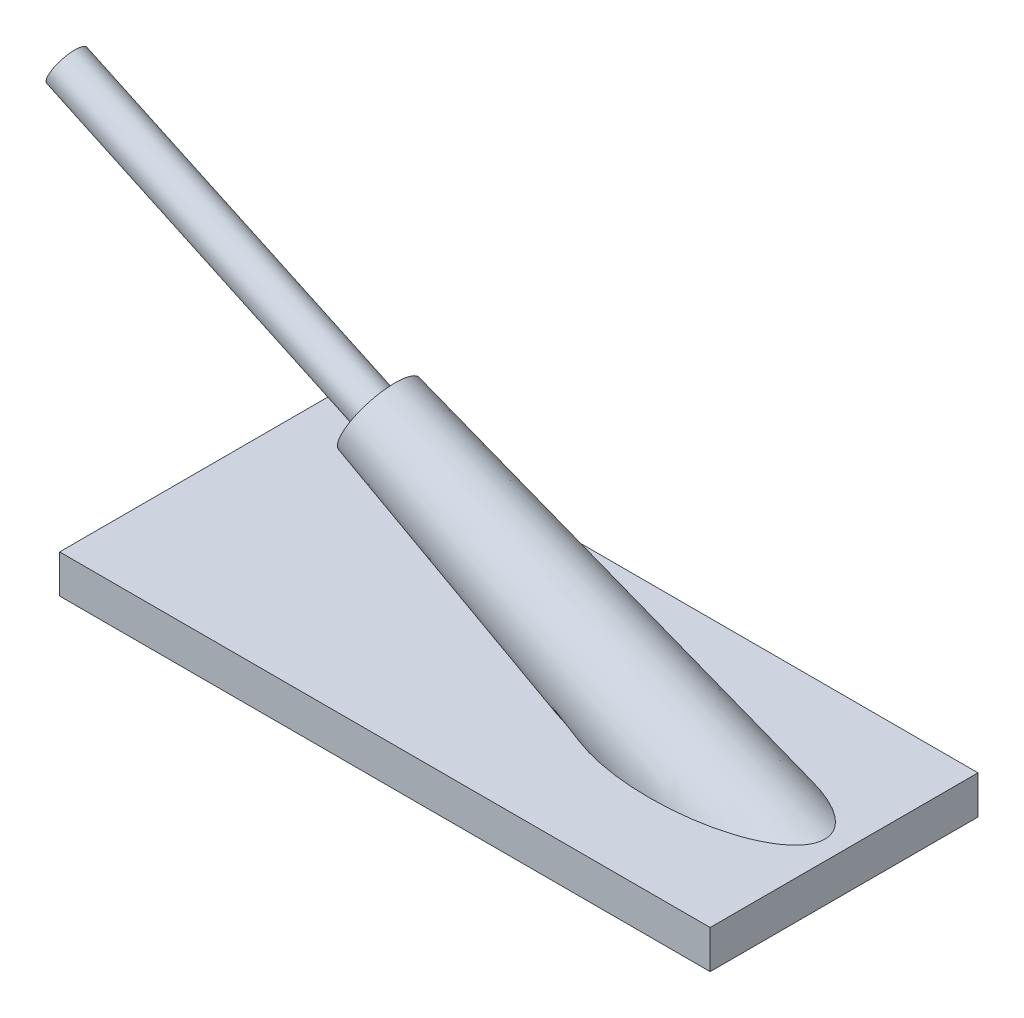
ISO-10303-21;
HEADER;
FILE_DESCRIPTION(('STEP AP214'),'2;1');
FILE_NAME('part.step','',(''),(''),'','','');
FILE_SCHEMA(('AUTOMOTIVE_DESIGN { 1 0 10303 214 1 1 1 1 }'));
ENDSEC;
DATA;
#1=APPLICATION_CONTEXT('core data for automotive mechanical design processes');
#2=APPLICATION_PROTOCOL_DEFINITION('international standard','automotive_design',2000,#1);
#3=PRODUCT_CONTEXT('',#1,'mechanical');
#4=PRODUCT('Part','Part','',(#3));
#5=PRODUCT_RELATED_PRODUCT_CATEGORY('part','',(#4));
#6=PRODUCT_DEFINITION_FORMATION('','',#4);
#7=PRODUCT_DEFINITION_CONTEXT('part definition',#1,'design');
#8=PRODUCT_DEFINITION('design','',#6,#7);
#9=PRODUCT_DEFINITION_SHAPE('','',#8);
#10=(LENGTH_UNIT() NAMED_UNIT(*) SI_UNIT(.MILLI.,.METRE.));
#11=(NAMED_UNIT(*) PLANE_ANGLE_UNIT() SI_UNIT($,.RADIAN.));
#12=(NAMED_UNIT(*) SI_UNIT($,.STERADIAN.) SOLID_ANGLE_UNIT());
#13=UNCERTAINTY_MEASURE_WITH_UNIT(LENGTH_MEASURE(1.E-05),#10,'distance_accuracy_value','');
#14=(GEOMETRIC_REPRESENTATION_CONTEXT(3) GLOBAL_UNCERTAINTY_ASSIGNED_CONTEXT((#13)) GLOBAL_UNIT_ASSIGNED_CONTEXT((#10,
#11,#12)) REPRESENTATION_CONTEXT('',''));
#15=CARTESIAN_POINT('',(0.,0.,0.));
#16=DIRECTION('',(0.,0.,1.));
#17=DIRECTION('',(1.,0.,0.));
#18=AXIS2_PLACEMENT_3D('',#15,#16,#17);
#19=CARTESIAN_POINT('',(85.,10.,35.));
#20=DIRECTION('',(-1.,0.,0.));
#21=DIRECTION('',(0.,0.,1.));
#22=AXIS2_PLACEMENT_3D('',#19,#20,#21);
#23=PLANE('',#22);
#24=DIRECTION('',(0.,0.,-1.));
#25=VECTOR('',#24,1.);
#26=CARTESIAN_POINT('',(85.,0.,35.));
#27=LINE('',#26,#25);
#28=CARTESIAN_POINT('',(85.,0.,35.));
#29=VERTEX_POINT('',#28);
#30=CARTESIAN_POINT('',(85.,0.,-35.));
#31=VERTEX_POINT('',#30);
#32=EDGE_CURVE('E118',#29,#31,#27,.T.);
#33=ORIENTED_EDGE('',*,*,#32,.T.);
#34=DIRECTION('',(0.,-1.,0.));
#35=VECTOR('',#34,1.);
#36=CARTESIAN_POINT('',(85.,10.,-35.));
#37=LINE('',#36,#35);
#38=CARTESIAN_POINT('',(85.,10.,-35.));
#39=VERTEX_POINT('',#38);
#40=EDGE_CURVE('E55',#39,#31,#37,.T.);
#41=ORIENTED_EDGE('',*,*,#40,.F.);
#42=DIRECTION('',(0.,0.,-1.));
#43=VECTOR('',#42,1.);
#44=CARTESIAN_POINT('',(85.,10.,35.));
#45=LINE('',#44,#43);
#46=CARTESIAN_POINT('',(85.,10.,35.));
#47=VERTEX_POINT('',#46);
#48=EDGE_CURVE('E100',#47,#39,#45,.T.);
#49=ORIENTED_EDGE('',*,*,#48,.F.);
#50=DIRECTION('',(0.,-1.,0.));
#51=VECTOR('',#50,1.);
#52=CARTESIAN_POINT('',(85.,10.,35.));
#53=LINE('',#52,#51);
#54=EDGE_CURVE('E114',#47,#29,#53,.T.);
#55=ORIENTED_EDGE('',*,*,#54,.T.);
#56=EDGE_LOOP('',(#33,#41,#49,#55));
#57=FACE_BOUND('',#56,.T.);
#58=ADVANCED_FACE('F45',(#57),#23,.F.);
#59=CARTESIAN_POINT('',(-85.,10.,-35.));
#60=DIRECTION('',(0.,0.,1.));
#61=DIRECTION('',(1.,0.,0.));
#62=AXIS2_PLACEMENT_3D('',#59,#60,#61);
#63=PLANE('',#62);
#64=DIRECTION('',(-1.,0.,0.));
#65=VECTOR('',#64,1.);
#66=CARTESIAN_POINT('',(-85.,0.,-35.));
#67=LINE('',#66,#65);
#68=CARTESIAN_POINT('',(-85.,0.,-35.));
#69=VERTEX_POINT('',#68);
#70=EDGE_CURVE('E106',#31,#69,#67,.T.);
#71=ORIENTED_EDGE('',*,*,#70,.T.);
#72=DIRECTION('',(0.,-1.,0.));
#73=VECTOR('',#72,1.);
#74=CARTESIAN_POINT('',(-85.,10.,-35.));
#75=LINE('',#74,#73);
#76=CARTESIAN_POINT('',(-85.,10.,-35.));
#77=VERTEX_POINT('',#76);
#78=EDGE_CURVE('E104',#77,#69,#75,.T.);
#79=ORIENTED_EDGE('',*,*,#78,.F.);
#80=DIRECTION('',(-1.,0.,0.));
#81=VECTOR('',#80,1.);
#82=CARTESIAN_POINT('',(-85.,10.,-35.));
#83=LINE('',#82,#81);
#84=EDGE_CURVE('E95',#39,#77,#83,.T.);
#85=ORIENTED_EDGE('',*,*,#84,.F.);
#86=ORIENTED_EDGE('',*,*,#40,.T.);
#87=EDGE_LOOP('',(#71,#79,#85,#86));
#88=FACE_BOUND('',#87,.T.);
#89=ADVANCED_FACE('F105',(#88),#63,.F.);
#90=CARTESIAN_POINT('',(-85.,10.,35.));
#91=DIRECTION('',(1.,0.,0.));
#92=DIRECTION('',(0.,0.,-1.));
#93=AXIS2_PLACEMENT_3D('',#90,#91,#92);
#94=PLANE('',#93);
#95=DIRECTION('',(0.,0.,1.));
#96=VECTOR('',#95,1.);
#97=CARTESIAN_POINT('',(-85.,0.,35.));
#98=LINE('',#97,#96);
#99=CARTESIAN_POINT('',(-85.,0.,35.));
#100=VERTEX_POINT('',#99);
#101=EDGE_CURVE('E81',#69,#100,#98,.T.);
#102=ORIENTED_EDGE('',*,*,#101,.T.);
#103=DIRECTION('',(0.,-1.,0.));
#104=VECTOR('',#103,1.);
#105=CARTESIAN_POINT('',(-85.,10.,35.));
#106=LINE('',#105,#104);
#107=CARTESIAN_POINT('',(-85.,10.,35.));
#108=VERTEX_POINT('',#107);
#109=EDGE_CURVE('E108',#108,#100,#106,.T.);
#110=ORIENTED_EDGE('',*,*,#109,.F.);
#111=DIRECTION('',(0.,0.,1.));
#112=VECTOR('',#111,1.);
#113=CARTESIAN_POINT('',(-85.,10.,35.));
#114=LINE('',#113,#112);
#115=EDGE_CURVE('E98',#77,#108,#114,.T.);
#116=ORIENTED_EDGE('',*,*,#115,.F.);
#117=ORIENTED_EDGE('',*,*,#78,.T.);
#118=EDGE_LOOP('',(#102,#110,#116,#117));
#119=FACE_BOUND('',#118,.T.);
#120=ADVANCED_FACE('F110',(#119),#94,.F.);
#121=CARTESIAN_POINT('',(-85.,10.,35.));
#122=DIRECTION('',(0.,0.,-1.));
#123=DIRECTION('',(-1.,0.,0.));
#124=AXIS2_PLACEMENT_3D('',#121,#122,#123);
#125=PLANE('',#124);
#126=DIRECTION('',(1.,0.,0.));
#127=VECTOR('',#126,1.);
#128=CARTESIAN_POINT('',(-85.,0.,35.));
#129=LINE('',#128,#127);
#130=EDGE_CURVE('E87',#100,#29,#129,.T.);
#131=ORIENTED_EDGE('',*,*,#130,.T.);
#132=ORIENTED_EDGE('',*,*,#54,.F.);
#133=DIRECTION('',(1.,0.,0.));
#134=VECTOR('',#133,1.);
#135=CARTESIAN_POINT('',(-85.,10.,35.));
#136=LINE('',#135,#134);
#137=EDGE_CURVE('E64',#108,#47,#136,.T.);
#138=ORIENTED_EDGE('',*,*,#137,.F.);
#139=ORIENTED_EDGE('',*,*,#109,.T.);
#140=EDGE_LOOP('',(#131,#132,#138,#139));
#141=FACE_BOUND('',#140,.T.);
#142=ADVANCED_FACE('F147',(#141),#125,.F.);
#143=CARTESIAN_POINT('',(0.,10.,0.));
#144=DIRECTION('',(0.,-1.,0.));
#145=DIRECTION('',(0.,0.,-1.));
#146=AXIS2_PLACEMENT_3D('',#143,#144,#145);
#147=PLANE('',#146);
#148=CARTESIAN_POINT('',(47.7246910534806,10.,0.));
#149=DIRECTION('',(0.,-1.,0.));
#150=DIRECTION('',(1.,0.,0.));
#151=AXIS2_PLACEMENT_3D('',#148,#149,#150);
#152=ELLIPSE('',#151,32.2753089465194,13.5914428933875);
#153=CARTESIAN_POINT('',(80.,10.,0.));
#154=VERTEX_POINT('',#153);
#155=EDGE_CURVE('E12',#154,#154,#152,.F.);
#156=ORIENTED_EDGE('',*,*,#155,.F.);
#157=EDGE_LOOP('',(#156));
#158=FACE_BOUND('',#157,.T.);
#159=ORIENTED_EDGE('',*,*,#48,.T.);
#160=ORIENTED_EDGE('',*,*,#84,.T.);
#161=ORIENTED_EDGE('',*,*,#115,.T.);
#162=ORIENTED_EDGE('',*,*,#137,.T.);
#163=EDGE_LOOP('',(#159,#160,#161,#162));
#164=FACE_BOUND('',#163,.T.);
#165=ADVANCED_FACE('F96',(#158,#164),#147,.F.);
#166=CARTESIAN_POINT('',(0.,0.,0.));
#167=DIRECTION('',(0.,-1.,0.));
#168=DIRECTION('',(0.,0.,-1.));
#169=AXIS2_PLACEMENT_3D('',#166,#167,#168);
#170=PLANE('',#169);
#171=ORIENTED_EDGE('',*,*,#32,.F.);
#172=ORIENTED_EDGE('',*,*,#130,.F.);
#173=ORIENTED_EDGE('',*,*,#101,.F.);
#174=ORIENTED_EDGE('',*,*,#70,.F.);
#175=EDGE_LOOP('',(#171,#172,#173,#174));
#176=FACE_BOUND('',#175,.T.);
#177=ADVANCED_FACE('F136',(#176),#170,.T.);
#178=CARTESIAN_POINT('',(-36.5677008332985,48.035643556663,0.));
#179=DIRECTION('',(0.90630778703665,-0.4226182617407,0.));
#180=DIRECTION('',(0.4226182617407,0.90630778703665,0.));
#181=AXIS2_PLACEMENT_3D('',#178,#179,#180);
#182=PLANE('',#181);
#183=CARTESIAN_POINT('',(-36.5677008332985,48.035643556663,0.));
#184=DIRECTION('',(0.90630778703665,-0.4226182617407,0.));
#185=DIRECTION('',(0.4226182617407,0.90630778703665,0.));
#186=AXIS2_PLACEMENT_3D('',#183,#184,#185);
#187=CIRCLE('',#186,5.);
#188=CARTESIAN_POINT('',(-34.454609524595,52.5671824918463,0.));
#189=VERTEX_POINT('',#188);
#190=EDGE_CURVE('E48',#189,#189,#187,.F.);
#191=ORIENTED_EDGE('',*,*,#190,.F.);
#192=EDGE_LOOP('',(#191));
#193=FACE_BOUND('',#192,.T.);
#194=CARTESIAN_POINT('',(-36.5677008332985,48.035643556663,0.));
#195=DIRECTION('',(-0.90630778703665,0.4226182617407,0.));
#196=DIRECTION('',(-0.4226182617407,-0.90630778703665,0.));
#197=AXIS2_PLACEMENT_3D('',#194,#195,#196);
#198=CIRCLE('',#197,9.99999999999998);
#199=CARTESIAN_POINT('',(-40.7938834507055,38.9725656862965,0.));
#200=VERTEX_POINT('',#199);
#201=EDGE_CURVE('E220',#200,#200,#198,.T.);
#202=ORIENTED_EDGE('',*,*,#201,.T.);
#203=EDGE_LOOP('',(#202));
#204=FACE_BOUND('',#203,.T.);
#205=ADVANCED_FACE('F138',(#193,#204),#182,.F.);
#206=CARTESIAN_POINT('',(73.7487831695145,-3.40577775458215,0.));
#207=DIRECTION('',(0.90630778703665,-0.4226182617407,0.));
#208=DIRECTION('',(0.4226182617407,0.90630778703665,0.));
#209=AXIS2_PLACEMENT_3D('',#206,#207,#208);
#210=CONICAL_SURFACE('',#209,14.7916391609245,0.0393455135783576);
#211=ORIENTED_EDGE('',*,*,#201,.F.);
#212=EDGE_LOOP('',(#211));
#213=FACE_BOUND('',#212,.T.);
#214=ORIENTED_EDGE('',*,*,#155,.T.);
#215=EDGE_LOOP('',(#214));
#216=FACE_BOUND('',#215,.T.);
#217=ADVANCED_FACE('F144',(#213,#216),#210,.T.);
#218=CARTESIAN_POINT('',(-118.135401666597,86.071287113326,0.));
#219=DIRECTION('',(0.90630778703665,-0.4226182617407,0.));
#220=DIRECTION('',(0.4226182617407,0.90630778703665,0.));
#221=AXIS2_PLACEMENT_3D('',#218,#219,#220);
#222=PLANE('',#221);
#223=CARTESIAN_POINT('',(-118.135401666597,86.071287113326,0.));
#224=DIRECTION('',(0.90630778703665,-0.4226182617407,0.));
#225=DIRECTION('',(0.4226182617407,0.90630778703665,0.));
#226=AXIS2_PLACEMENT_3D('',#223,#224,#225);
#227=CIRCLE('',#226,5.);
#228=CARTESIAN_POINT('',(-116.022310357893,90.6028260485093,0.));
#229=VERTEX_POINT('',#228);
#230=EDGE_CURVE('E122',#229,#229,#227,.T.);
#231=ORIENTED_EDGE('',*,*,#230,.F.);
#232=EDGE_LOOP('',(#231));
#233=FACE_BOUND('',#232,.T.);
#234=ADVANCED_FACE('F175',(#233),#222,.F.);
#235=CARTESIAN_POINT('',(-118.135401666597,86.071287113326,0.));
#236=DIRECTION('',(0.90630778703665,-0.4226182617407,0.));
#237=DIRECTION('',(0.4226182617407,0.90630778703665,0.));
#238=AXIS2_PLACEMENT_3D('',#235,#236,#237);
#239=CYLINDRICAL_SURFACE('',#238,5.);
#240=ORIENTED_EDGE('',*,*,#230,.T.);
#241=EDGE_LOOP('',(#240));
#242=FACE_BOUND('',#241,.T.);
#243=ORIENTED_EDGE('',*,*,#190,.T.);
#244=EDGE_LOOP('',(#243));
#245=FACE_BOUND('',#244,.T.);
#246=ADVANCED_FACE('F196',(#242,#245),#239,.T.);
#247=CLOSED_SHELL('',(#58,#89,#120,#142,#165,#177,#205,#217,#234,#246));
#248=MANIFOLD_SOLID_BREP('B2',#247);
#249=ADVANCED_BREP_SHAPE_REPRESENTATION('',(#18,#248),#14);
#250=SHAPE_DEFINITION_REPRESENTATION(#9,#249);
ENDSEC;
END-ISO-10303-21;
